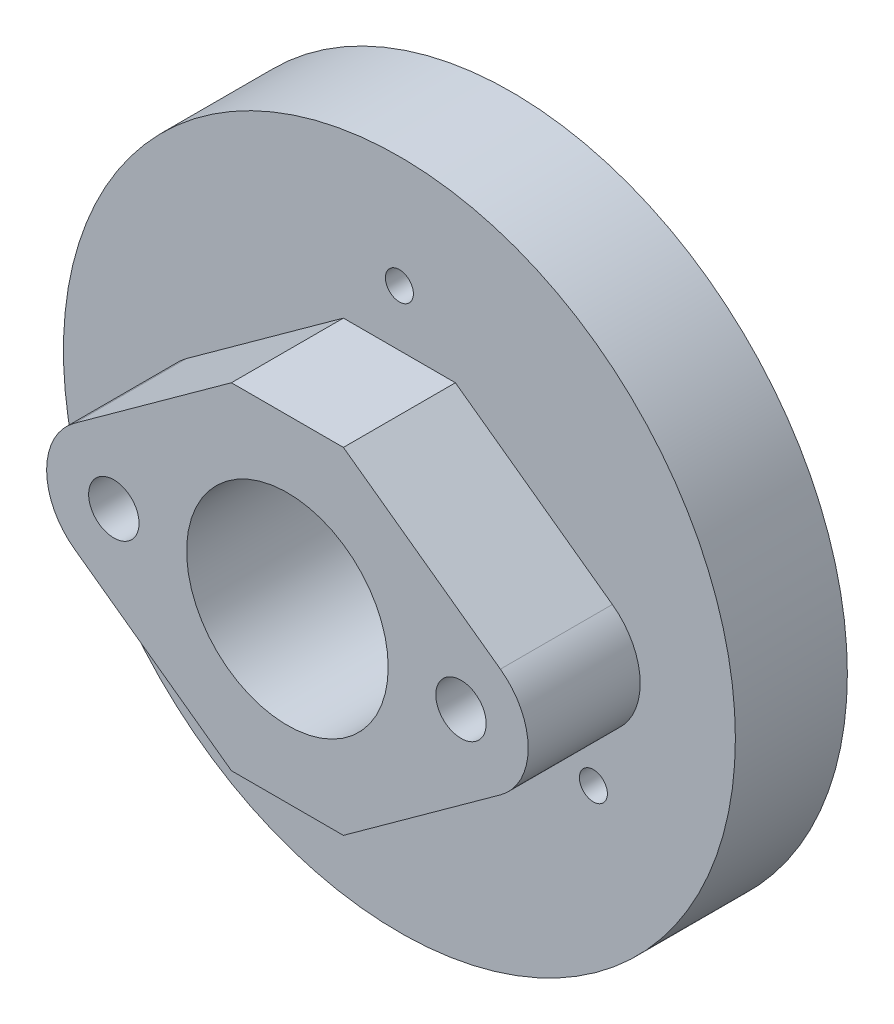
ISO-10303-21;
HEADER;
FILE_DESCRIPTION(('STEP AP214'),'2;1');
FILE_NAME('part.step','',(''),(''),'','','');
FILE_SCHEMA(('AUTOMOTIVE_DESIGN { 1 0 10303 214 1 1 1 1 }'));
ENDSEC;
DATA;
#1=APPLICATION_CONTEXT('core data for automotive mechanical design processes');
#2=APPLICATION_PROTOCOL_DEFINITION('international standard','automotive_design',2000,#1);
#3=PRODUCT_CONTEXT('',#1,'mechanical');
#4=PRODUCT('Part','Part','',(#3));
#5=PRODUCT_RELATED_PRODUCT_CATEGORY('part','',(#4));
#6=PRODUCT_DEFINITION_FORMATION('','',#4);
#7=PRODUCT_DEFINITION_CONTEXT('part definition',#1,'design');
#8=PRODUCT_DEFINITION('design','',#6,#7);
#9=PRODUCT_DEFINITION_SHAPE('','',#8);
#10=(LENGTH_UNIT() NAMED_UNIT(*) SI_UNIT(.MILLI.,.METRE.));
#11=(NAMED_UNIT(*) PLANE_ANGLE_UNIT() SI_UNIT($,.RADIAN.));
#12=(NAMED_UNIT(*) SI_UNIT($,.STERADIAN.) SOLID_ANGLE_UNIT());
#13=UNCERTAINTY_MEASURE_WITH_UNIT(LENGTH_MEASURE(1.E-05),#10,'distance_accuracy_value','');
#14=(GEOMETRIC_REPRESENTATION_CONTEXT(3) GLOBAL_UNCERTAINTY_ASSIGNED_CONTEXT((#13)) GLOBAL_UNIT_ASSIGNED_CONTEXT((#10,
#11,#12)) REPRESENTATION_CONTEXT('',''));
#15=CARTESIAN_POINT('',(0.,0.,0.));
#16=DIRECTION('',(0.,0.,1.));
#17=DIRECTION('',(1.,0.,0.));
#18=AXIS2_PLACEMENT_3D('',#15,#16,#17);
#19=CARTESIAN_POINT('',(15.5,0.,0.));
#20=DIRECTION('',(0.,0.,1.));
#21=DIRECTION('',(1.,0.,0.));
#22=AXIS2_PLACEMENT_3D('',#19,#20,#21);
#23=CYLINDRICAL_SURFACE('',#22,2.25);
#24=CARTESIAN_POINT('',(15.5,0.,20.));
#25=DIRECTION('',(0.,0.,1.));
#26=DIRECTION('',(1.,0.,0.));
#27=AXIS2_PLACEMENT_3D('',#24,#25,#26);
#28=CIRCLE('',#27,2.25);
#29=CARTESIAN_POINT('',(17.75,0.,20.));
#30=VERTEX_POINT('',#29);
#31=EDGE_CURVE('E165',#30,#30,#28,.T.);
#32=ORIENTED_EDGE('',*,*,#31,.T.);
#33=EDGE_LOOP('',(#32));
#34=FACE_BOUND('',#33,.T.);
#35=CARTESIAN_POINT('',(15.5,0.,5.));
#36=DIRECTION('',(0.,0.,-1.));
#37=DIRECTION('',(-1.,0.,0.));
#38=AXIS2_PLACEMENT_3D('',#35,#36,#37);
#39=CIRCLE('',#38,2.25);
#40=CARTESIAN_POINT('',(13.25,0.,5.));
#41=VERTEX_POINT('',#40);
#42=EDGE_CURVE('E44',#41,#41,#39,.F.);
#43=ORIENTED_EDGE('',*,*,#42,.F.);
#44=EDGE_LOOP('',(#43));
#45=FACE_BOUND('',#44,.T.);
#46=ADVANCED_FACE('F41',(#34,#45),#23,.F.);
#47=CARTESIAN_POINT('',(-15.5,0.,0.));
#48=DIRECTION('',(0.,0.,1.));
#49=DIRECTION('',(1.,0.,0.));
#50=AXIS2_PLACEMENT_3D('',#47,#48,#49);
#51=CYLINDRICAL_SURFACE('',#50,2.25);
#52=CARTESIAN_POINT('',(-15.5,0.,20.));
#53=DIRECTION('',(0.,0.,1.));
#54=DIRECTION('',(1.,0.,0.));
#55=AXIS2_PLACEMENT_3D('',#52,#53,#54);
#56=CIRCLE('',#55,2.25);
#57=CARTESIAN_POINT('',(-13.25,0.,20.));
#58=VERTEX_POINT('',#57);
#59=EDGE_CURVE('E180',#58,#58,#56,.T.);
#60=ORIENTED_EDGE('',*,*,#59,.T.);
#61=EDGE_LOOP('',(#60));
#62=FACE_BOUND('',#61,.T.);
#63=CARTESIAN_POINT('',(-15.5,0.,5.));
#64=DIRECTION('',(0.,0.,-1.));
#65=DIRECTION('',(-1.,0.,0.));
#66=AXIS2_PLACEMENT_3D('',#63,#64,#65);
#67=CIRCLE('',#66,2.25);
#68=CARTESIAN_POINT('',(-17.75,0.,5.));
#69=VERTEX_POINT('',#68);
#70=EDGE_CURVE('E156',#69,#69,#67,.F.);
#71=ORIENTED_EDGE('',*,*,#70,.F.);
#72=EDGE_LOOP('',(#71));
#73=FACE_BOUND('',#72,.T.);
#74=ADVANCED_FACE('F262',(#62,#73),#51,.F.);
#75=CARTESIAN_POINT('',(0.,0.,10.));
#76=DIRECTION('',(0.,0.,1.));
#77=DIRECTION('',(1.,0.,0.));
#78=AXIS2_PLACEMENT_3D('',#75,#76,#77);
#79=PLANE('',#78);
#80=DIRECTION('',(-0.810254618541581,-0.586078026487973,0.));
#81=VECTOR('',#80,1.);
#82=CARTESIAN_POINT('',(-5.,15.,10.));
#83=LINE('',#82,#81);
#84=CARTESIAN_POINT('',(-5.,15.,10.));
#85=VERTEX_POINT('',#84);
#86=CARTESIAN_POINT('',(-19.0164681589278,4.86152771124949,10.));
#87=VERTEX_POINT('',#86);
#88=EDGE_CURVE('E59',#85,#87,#83,.T.);
#89=ORIENTED_EDGE('',*,*,#88,.F.);
#90=DIRECTION('',(-1.,0.,0.));
#91=VECTOR('',#90,1.);
#92=CARTESIAN_POINT('',(5.,15.,10.));
#93=LINE('',#92,#91);
#94=CARTESIAN_POINT('',(5.,15.,10.));
#95=VERTEX_POINT('',#94);
#96=EDGE_CURVE('E65',#95,#85,#93,.T.);
#97=ORIENTED_EDGE('',*,*,#96,.F.);
#98=DIRECTION('',(-0.810254618541581,0.586078026487973,0.));
#99=VECTOR('',#98,1.);
#100=CARTESIAN_POINT('',(5.,15.,10.));
#101=LINE('',#100,#99);
#102=CARTESIAN_POINT('',(19.0164681589278,4.86152771124949,10.));
#103=VERTEX_POINT('',#102);
#104=EDGE_CURVE('E211',#103,#95,#101,.T.);
#105=ORIENTED_EDGE('',*,*,#104,.F.);
#106=CARTESIAN_POINT('',(15.5,0.,10.));
#107=DIRECTION('',(0.,0.,1.));
#108=DIRECTION('',(-1.,0.,0.));
#109=AXIS2_PLACEMENT_3D('',#106,#107,#108);
#110=CIRCLE('',#109,6.);
#111=CARTESIAN_POINT('',(19.0164681589278,-4.86152771124948,10.));
#112=VERTEX_POINT('',#111);
#113=EDGE_CURVE('E208',#112,#103,#110,.T.);
#114=ORIENTED_EDGE('',*,*,#113,.F.);
#115=DIRECTION('',(0.810254618541581,0.586078026487973,0.));
#116=VECTOR('',#115,1.);
#117=CARTESIAN_POINT('',(19.0164681589278,-4.86152771124948,10.));
#118=LINE('',#117,#116);
#119=CARTESIAN_POINT('',(5.,-15.,10.));
#120=VERTEX_POINT('',#119);
#121=EDGE_CURVE('E202',#120,#112,#118,.T.);
#122=ORIENTED_EDGE('',*,*,#121,.F.);
#123=DIRECTION('',(1.,0.,0.));
#124=VECTOR('',#123,1.);
#125=CARTESIAN_POINT('',(-5.,-15.,10.));
#126=LINE('',#125,#124);
#127=CARTESIAN_POINT('',(-5.,-15.,10.));
#128=VERTEX_POINT('',#127);
#129=EDGE_CURVE('E205',#128,#120,#126,.T.);
#130=ORIENTED_EDGE('',*,*,#129,.F.);
#131=DIRECTION('',(0.810254618541581,-0.586078026487973,0.));
#132=VECTOR('',#131,1.);
#133=CARTESIAN_POINT('',(-19.0164681589278,-4.86152771124949,10.));
#134=LINE('',#133,#132);
#135=CARTESIAN_POINT('',(-19.0164681589278,-4.86152771124949,10.));
#136=VERTEX_POINT('',#135);
#137=EDGE_CURVE('E200',#136,#128,#134,.T.);
#138=ORIENTED_EDGE('',*,*,#137,.F.);
#139=CARTESIAN_POINT('',(-15.5,0.,10.));
#140=DIRECTION('',(0.,0.,1.));
#141=DIRECTION('',(1.,0.,0.));
#142=AXIS2_PLACEMENT_3D('',#139,#140,#141);
#143=CIRCLE('',#142,6.);
#144=EDGE_CURVE('E197',#87,#136,#143,.T.);
#145=ORIENTED_EDGE('',*,*,#144,.F.);
#146=EDGE_LOOP('',(#89,#97,#105,#114,#122,#130,#138,#145));
#147=FACE_BOUND('',#146,.T.);
#148=CARTESIAN_POINT('',(17.3205080756887,-10.0000000000001,10.));
#149=DIRECTION('',(0.,0.,1.));
#150=DIRECTION('',(1.,0.,0.));
#151=AXIS2_PLACEMENT_3D('',#148,#149,#150);
#152=CIRCLE('',#151,1.25);
#153=CARTESIAN_POINT('',(18.5705080756887,-10.0000000000001,10.));
#154=VERTEX_POINT('',#153);
#155=EDGE_CURVE('E143',#154,#154,#152,.T.);
#156=ORIENTED_EDGE('',*,*,#155,.F.);
#157=EDGE_LOOP('',(#156));
#158=FACE_BOUND('',#157,.T.);
#159=CARTESIAN_POINT('',(0.,0.,10.));
#160=DIRECTION('',(0.,0.,1.));
#161=DIRECTION('',(1.,0.,0.));
#162=AXIS2_PLACEMENT_3D('',#159,#160,#161);
#163=CIRCLE('',#162,30.);
#164=CARTESIAN_POINT('',(30.,0.,10.));
#165=VERTEX_POINT('',#164);
#166=EDGE_CURVE('E11',#165,#165,#163,.T.);
#167=ORIENTED_EDGE('',*,*,#166,.T.);
#168=EDGE_LOOP('',(#167));
#169=FACE_BOUND('',#168,.T.);
#170=CARTESIAN_POINT('',(0.,20.,10.));
#171=DIRECTION('',(0.,0.,1.));
#172=DIRECTION('',(1.,0.,0.));
#173=AXIS2_PLACEMENT_3D('',#170,#171,#172);
#174=CIRCLE('',#173,1.25);
#175=CARTESIAN_POINT('',(1.25,20.,10.));
#176=VERTEX_POINT('',#175);
#177=EDGE_CURVE('E150',#176,#176,#174,.T.);
#178=ORIENTED_EDGE('',*,*,#177,.F.);
#179=EDGE_LOOP('',(#178));
#180=FACE_BOUND('',#179,.T.);
#181=CARTESIAN_POINT('',(-17.3205080756889,-9.99999999999984,10.));
#182=DIRECTION('',(0.,0.,1.));
#183=DIRECTION('',(1.,0.,0.));
#184=AXIS2_PLACEMENT_3D('',#181,#182,#183);
#185=CIRCLE('',#184,1.25);
#186=CARTESIAN_POINT('',(-16.0705080756889,-9.99999999999984,10.));
#187=VERTEX_POINT('',#186);
#188=EDGE_CURVE('E135',#187,#187,#185,.T.);
#189=ORIENTED_EDGE('',*,*,#188,.F.);
#190=EDGE_LOOP('',(#189));
#191=FACE_BOUND('',#190,.T.);
#192=ADVANCED_FACE('F234',(#147,#158,#169,#180,#191),#79,.T.);
#193=CARTESIAN_POINT('',(0.,0.,0.));
#194=DIRECTION('',(0.,0.,1.));
#195=DIRECTION('',(1.,0.,0.));
#196=AXIS2_PLACEMENT_3D('',#193,#194,#195);
#197=PLANE('',#196);
#198=CARTESIAN_POINT('',(15.5,0.,0.));
#199=DIRECTION('',(0.,0.,-1.));
#200=DIRECTION('',(-1.,0.,0.));
#201=AXIS2_PLACEMENT_3D('',#198,#199,#200);
#202=CIRCLE('',#201,4.);
#203=CARTESIAN_POINT('',(11.5,0.,0.));
#204=VERTEX_POINT('',#203);
#205=EDGE_CURVE('E163',#204,#204,#202,.T.);
#206=ORIENTED_EDGE('',*,*,#205,.F.);
#207=EDGE_LOOP('',(#206));
#208=FACE_BOUND('',#207,.T.);
#209=CARTESIAN_POINT('',(-15.5,0.,0.));
#210=DIRECTION('',(0.,0.,-1.));
#211=DIRECTION('',(-1.,0.,0.));
#212=AXIS2_PLACEMENT_3D('',#209,#210,#211);
#213=CIRCLE('',#212,4.);
#214=CARTESIAN_POINT('',(-19.5,0.,0.));
#215=VERTEX_POINT('',#214);
#216=EDGE_CURVE('E166',#215,#215,#213,.T.);
#217=ORIENTED_EDGE('',*,*,#216,.F.);
#218=EDGE_LOOP('',(#217));
#219=FACE_BOUND('',#218,.T.);
#220=CARTESIAN_POINT('',(0.,0.,0.));
#221=DIRECTION('',(0.,0.,1.));
#222=DIRECTION('',(1.,0.,0.));
#223=AXIS2_PLACEMENT_3D('',#220,#221,#222);
#224=CIRCLE('',#223,30.);
#225=CARTESIAN_POINT('',(30.,0.,0.));
#226=VERTEX_POINT('',#225);
#227=EDGE_CURVE('E49',#226,#226,#224,.T.);
#228=ORIENTED_EDGE('',*,*,#227,.F.);
#229=EDGE_LOOP('',(#228));
#230=FACE_BOUND('',#229,.T.);
#231=CARTESIAN_POINT('',(0.,0.,0.));
#232=DIRECTION('',(0.,0.,1.));
#233=DIRECTION('',(1.,0.,0.));
#234=AXIS2_PLACEMENT_3D('',#231,#232,#233);
#235=CIRCLE('',#234,9.);
#236=CARTESIAN_POINT('',(9.,0.,0.));
#237=VERTEX_POINT('',#236);
#238=EDGE_CURVE('E147',#237,#237,#235,.T.);
#239=ORIENTED_EDGE('',*,*,#238,.T.);
#240=EDGE_LOOP('',(#239));
#241=FACE_BOUND('',#240,.T.);
#242=CARTESIAN_POINT('',(0.,20.,0.));
#243=DIRECTION('',(0.,0.,1.));
#244=DIRECTION('',(1.,0.,0.));
#245=AXIS2_PLACEMENT_3D('',#242,#243,#244);
#246=CIRCLE('',#245,1.25);
#247=CARTESIAN_POINT('',(1.25,20.,0.));
#248=VERTEX_POINT('',#247);
#249=EDGE_CURVE('E145',#248,#248,#246,.T.);
#250=ORIENTED_EDGE('',*,*,#249,.T.);
#251=EDGE_LOOP('',(#250));
#252=FACE_BOUND('',#251,.T.);
#253=CARTESIAN_POINT('',(17.3205080756887,-10.0000000000001,0.));
#254=DIRECTION('',(0.,0.,1.));
#255=DIRECTION('',(1.,0.,0.));
#256=AXIS2_PLACEMENT_3D('',#253,#254,#255);
#257=CIRCLE('',#256,1.25);
#258=CARTESIAN_POINT('',(18.5705080756887,-10.0000000000001,0.));
#259=VERTEX_POINT('',#258);
#260=EDGE_CURVE('E139',#259,#259,#257,.T.);
#261=ORIENTED_EDGE('',*,*,#260,.T.);
#262=EDGE_LOOP('',(#261));
#263=FACE_BOUND('',#262,.T.);
#264=CARTESIAN_POINT('',(-17.3205080756889,-9.99999999999984,0.));
#265=DIRECTION('',(0.,0.,1.));
#266=DIRECTION('',(1.,0.,0.));
#267=AXIS2_PLACEMENT_3D('',#264,#265,#266);
#268=CIRCLE('',#267,1.25);
#269=CARTESIAN_POINT('',(-16.0705080756889,-9.99999999999984,0.));
#270=VERTEX_POINT('',#269);
#271=EDGE_CURVE('E129',#270,#270,#268,.T.);
#272=ORIENTED_EDGE('',*,*,#271,.T.);
#273=EDGE_LOOP('',(#272));
#274=FACE_BOUND('',#273,.T.);
#275=ADVANCED_FACE('F304',(#208,#219,#230,#241,#252,#263,#274),#197,.F.);
#276=CARTESIAN_POINT('',(0.,0.,10.));
#277=DIRECTION('',(0.,0.,-1.));
#278=DIRECTION('',(-1.,0.,0.));
#279=AXIS2_PLACEMENT_3D('',#276,#277,#278);
#280=CYLINDRICAL_SURFACE('',#279,30.);
#281=ORIENTED_EDGE('',*,*,#166,.F.);
#282=EDGE_LOOP('',(#281));
#283=FACE_BOUND('',#282,.T.);
#284=ORIENTED_EDGE('',*,*,#227,.T.);
#285=EDGE_LOOP('',(#284));
#286=FACE_BOUND('',#285,.T.);
#287=ADVANCED_FACE('F43',(#283,#286),#280,.T.);
#288=CARTESIAN_POINT('',(0.,0.,10.));
#289=DIRECTION('',(0.,0.,-1.));
#290=DIRECTION('',(-1.,0.,0.));
#291=AXIS2_PLACEMENT_3D('',#288,#289,#290);
#292=CYLINDRICAL_SURFACE('',#291,9.);
#293=ORIENTED_EDGE('',*,*,#238,.F.);
#294=EDGE_LOOP('',(#293));
#295=FACE_BOUND('',#294,.T.);
#296=CARTESIAN_POINT('',(0.,0.,20.));
#297=DIRECTION('',(0.,0.,1.));
#298=DIRECTION('',(1.,0.,0.));
#299=AXIS2_PLACEMENT_3D('',#296,#297,#298);
#300=CIRCLE('',#299,9.);
#301=CARTESIAN_POINT('',(9.,0.,20.));
#302=VERTEX_POINT('',#301);
#303=EDGE_CURVE('E176',#302,#302,#300,.T.);
#304=ORIENTED_EDGE('',*,*,#303,.T.);
#305=EDGE_LOOP('',(#304));
#306=FACE_BOUND('',#305,.T.);
#307=ADVANCED_FACE('F299',(#295,#306),#292,.F.);
#308=CARTESIAN_POINT('',(0.,20.,10.));
#309=DIRECTION('',(0.,0.,-1.));
#310=DIRECTION('',(-1.,0.,0.));
#311=AXIS2_PLACEMENT_3D('',#308,#309,#310);
#312=CYLINDRICAL_SURFACE('',#311,1.25);
#313=ORIENTED_EDGE('',*,*,#177,.T.);
#314=EDGE_LOOP('',(#313));
#315=FACE_BOUND('',#314,.T.);
#316=ORIENTED_EDGE('',*,*,#249,.F.);
#317=EDGE_LOOP('',(#316));
#318=FACE_BOUND('',#317,.T.);
#319=ADVANCED_FACE('F292',(#315,#318),#312,.F.);
#320=CARTESIAN_POINT('',(17.3205080756887,-10.0000000000001,10.));
#321=DIRECTION('',(0.,0.,-1.));
#322=DIRECTION('',(-1.,0.,0.));
#323=AXIS2_PLACEMENT_3D('',#320,#321,#322);
#324=CYLINDRICAL_SURFACE('',#323,1.25);
#325=ORIENTED_EDGE('',*,*,#155,.T.);
#326=EDGE_LOOP('',(#325));
#327=FACE_BOUND('',#326,.T.);
#328=ORIENTED_EDGE('',*,*,#260,.F.);
#329=EDGE_LOOP('',(#328));
#330=FACE_BOUND('',#329,.T.);
#331=ADVANCED_FACE('F278',(#327,#330),#324,.F.);
#332=CARTESIAN_POINT('',(-17.3205080756889,-9.99999999999984,10.));
#333=DIRECTION('',(0.,0.,-1.));
#334=DIRECTION('',(-1.,0.,0.));
#335=AXIS2_PLACEMENT_3D('',#332,#333,#334);
#336=CYLINDRICAL_SURFACE('',#335,1.25);
#337=ORIENTED_EDGE('',*,*,#188,.T.);
#338=EDGE_LOOP('',(#337));
#339=FACE_BOUND('',#338,.T.);
#340=ORIENTED_EDGE('',*,*,#271,.F.);
#341=EDGE_LOOP('',(#340));
#342=FACE_BOUND('',#341,.T.);
#343=ADVANCED_FACE('F272',(#339,#342),#336,.F.);
#344=CARTESIAN_POINT('',(-15.5,0.,20.));
#345=DIRECTION('',(0.,0.,1.));
#346=DIRECTION('',(1.,0.,0.));
#347=AXIS2_PLACEMENT_3D('',#344,#345,#346);
#348=PLANE('',#347);
#349=ORIENTED_EDGE('',*,*,#59,.F.);
#350=EDGE_LOOP('',(#349));
#351=FACE_BOUND('',#350,.T.);
#352=ORIENTED_EDGE('',*,*,#31,.F.);
#353=EDGE_LOOP('',(#352));
#354=FACE_BOUND('',#353,.T.);
#355=DIRECTION('',(-0.810254618541581,-0.586078026487973,0.));
#356=VECTOR('',#355,1.);
#357=CARTESIAN_POINT('',(-5.,15.,20.));
#358=LINE('',#357,#356);
#359=CARTESIAN_POINT('',(-5.,15.,20.));
#360=VERTEX_POINT('',#359);
#361=CARTESIAN_POINT('',(-19.0164681589278,4.86152771124949,20.));
#362=VERTEX_POINT('',#361);
#363=EDGE_CURVE('E120',#360,#362,#358,.T.);
#364=ORIENTED_EDGE('',*,*,#363,.T.);
#365=CARTESIAN_POINT('',(-15.5,0.,20.));
#366=DIRECTION('',(0.,0.,1.));
#367=DIRECTION('',(1.,0.,0.));
#368=AXIS2_PLACEMENT_3D('',#365,#366,#367);
#369=CIRCLE('',#368,6.);
#370=CARTESIAN_POINT('',(-19.0164681589278,-4.86152771124949,20.));
#371=VERTEX_POINT('',#370);
#372=EDGE_CURVE('E106',#362,#371,#369,.T.);
#373=ORIENTED_EDGE('',*,*,#372,.T.);
#374=DIRECTION('',(0.810254618541581,-0.586078026487973,0.));
#375=VECTOR('',#374,1.);
#376=CARTESIAN_POINT('',(-19.0164681589278,-4.86152771124949,20.));
#377=LINE('',#376,#375);
#378=CARTESIAN_POINT('',(-5.,-15.,20.));
#379=VERTEX_POINT('',#378);
#380=EDGE_CURVE('E118',#371,#379,#377,.T.);
#381=ORIENTED_EDGE('',*,*,#380,.T.);
#382=DIRECTION('',(1.,0.,0.));
#383=VECTOR('',#382,1.);
#384=CARTESIAN_POINT('',(-5.,-15.,20.));
#385=LINE('',#384,#383);
#386=CARTESIAN_POINT('',(5.,-15.,20.));
#387=VERTEX_POINT('',#386);
#388=EDGE_CURVE('E188',#379,#387,#385,.T.);
#389=ORIENTED_EDGE('',*,*,#388,.T.);
#390=DIRECTION('',(0.810254618541581,0.586078026487973,0.));
#391=VECTOR('',#390,1.);
#392=CARTESIAN_POINT('',(19.0164681589278,-4.86152771124948,20.));
#393=LINE('',#392,#391);
#394=CARTESIAN_POINT('',(19.0164681589278,-4.86152771124948,20.));
#395=VERTEX_POINT('',#394);
#396=EDGE_CURVE('E186',#387,#395,#393,.T.);
#397=ORIENTED_EDGE('',*,*,#396,.T.);
#398=CARTESIAN_POINT('',(15.5,0.,20.));
#399=DIRECTION('',(0.,0.,1.));
#400=DIRECTION('',(-1.,0.,0.));
#401=AXIS2_PLACEMENT_3D('',#398,#399,#400);
#402=CIRCLE('',#401,6.);
#403=CARTESIAN_POINT('',(19.0164681589278,4.86152771124949,20.));
#404=VERTEX_POINT('',#403);
#405=EDGE_CURVE('E187',#395,#404,#402,.T.);
#406=ORIENTED_EDGE('',*,*,#405,.T.);
#407=DIRECTION('',(-0.810254618541581,0.586078026487973,0.));
#408=VECTOR('',#407,1.);
#409=CARTESIAN_POINT('',(5.,15.,20.));
#410=LINE('',#409,#408);
#411=CARTESIAN_POINT('',(5.,15.,20.));
#412=VERTEX_POINT('',#411);
#413=EDGE_CURVE('E195',#404,#412,#410,.T.);
#414=ORIENTED_EDGE('',*,*,#413,.T.);
#415=DIRECTION('',(-1.,0.,0.));
#416=VECTOR('',#415,1.);
#417=CARTESIAN_POINT('',(5.,15.,20.));
#418=LINE('',#417,#416);
#419=EDGE_CURVE('E123',#412,#360,#418,.T.);
#420=ORIENTED_EDGE('',*,*,#419,.T.);
#421=EDGE_LOOP('',(#364,#373,#381,#389,#397,#406,#414,#420));
#422=FACE_BOUND('',#421,.T.);
#423=ORIENTED_EDGE('',*,*,#303,.F.);
#424=EDGE_LOOP('',(#423));
#425=FACE_BOUND('',#424,.T.);
#426=ADVANCED_FACE('F117',(#351,#354,#422,#425),#348,.T.);
#427=CARTESIAN_POINT('',(-5.,15.,20.));
#428=DIRECTION('',(0.586078026487973,-0.810254618541581,0.));
#429=DIRECTION('',(0.810254618541581,0.586078026487973,0.));
#430=AXIS2_PLACEMENT_3D('',#427,#428,#429);
#431=PLANE('',#430);
#432=ORIENTED_EDGE('',*,*,#88,.T.);
#433=DIRECTION('',(0.,0.,-1.));
#434=VECTOR('',#433,1.);
#435=CARTESIAN_POINT('',(-19.0164681589278,4.86152771124949,20.));
#436=LINE('',#435,#434);
#437=EDGE_CURVE('E112',#362,#87,#436,.T.);
#438=ORIENTED_EDGE('',*,*,#437,.F.);
#439=ORIENTED_EDGE('',*,*,#363,.F.);
#440=DIRECTION('',(0.,0.,-1.));
#441=VECTOR('',#440,1.);
#442=CARTESIAN_POINT('',(-5.,15.,20.));
#443=LINE('',#442,#441);
#444=EDGE_CURVE('E191',#360,#85,#443,.T.);
#445=ORIENTED_EDGE('',*,*,#444,.T.);
#446=EDGE_LOOP('',(#432,#438,#439,#445));
#447=FACE_BOUND('',#446,.T.);
#448=ADVANCED_FACE('F126',(#447),#431,.F.);
#449=CARTESIAN_POINT('',(-15.5,0.,20.));
#450=DIRECTION('',(0.,0.,-1.));
#451=DIRECTION('',(-1.,0.,0.));
#452=AXIS2_PLACEMENT_3D('',#449,#450,#451);
#453=CYLINDRICAL_SURFACE('',#452,6.);
#454=ORIENTED_EDGE('',*,*,#144,.T.);
#455=DIRECTION('',(0.,0.,-1.));
#456=VECTOR('',#455,1.);
#457=CARTESIAN_POINT('',(-19.0164681589278,-4.86152771124949,20.));
#458=LINE('',#457,#456);
#459=EDGE_CURVE('E114',#371,#136,#458,.T.);
#460=ORIENTED_EDGE('',*,*,#459,.F.);
#461=ORIENTED_EDGE('',*,*,#372,.F.);
#462=ORIENTED_EDGE('',*,*,#437,.T.);
#463=EDGE_LOOP('',(#454,#460,#461,#462));
#464=FACE_BOUND('',#463,.T.);
#465=ADVANCED_FACE('F108',(#464),#453,.T.);
#466=CARTESIAN_POINT('',(-19.0164681589278,-4.86152771124949,20.));
#467=DIRECTION('',(0.586078026487973,0.810254618541581,0.));
#468=DIRECTION('',(-0.810254618541581,0.586078026487973,0.));
#469=AXIS2_PLACEMENT_3D('',#466,#467,#468);
#470=PLANE('',#469);
#471=ORIENTED_EDGE('',*,*,#137,.T.);
#472=DIRECTION('',(0.,0.,-1.));
#473=VECTOR('',#472,1.);
#474=CARTESIAN_POINT('',(-5.,-15.,20.));
#475=LINE('',#474,#473);
#476=EDGE_CURVE('E134',#379,#128,#475,.T.);
#477=ORIENTED_EDGE('',*,*,#476,.F.);
#478=ORIENTED_EDGE('',*,*,#380,.F.);
#479=ORIENTED_EDGE('',*,*,#459,.T.);
#480=EDGE_LOOP('',(#471,#477,#478,#479));
#481=FACE_BOUND('',#480,.T.);
#482=ADVANCED_FACE('F233',(#481),#470,.F.);
#483=CARTESIAN_POINT('',(-5.,-15.,20.));
#484=DIRECTION('',(0.,1.,0.));
#485=DIRECTION('',(-1.,0.,0.));
#486=AXIS2_PLACEMENT_3D('',#483,#484,#485);
#487=PLANE('',#486);
#488=ORIENTED_EDGE('',*,*,#129,.T.);
#489=DIRECTION('',(0.,0.,-1.));
#490=VECTOR('',#489,1.);
#491=CARTESIAN_POINT('',(5.,-15.,20.));
#492=LINE('',#491,#490);
#493=EDGE_CURVE('E221',#387,#120,#492,.T.);
#494=ORIENTED_EDGE('',*,*,#493,.F.);
#495=ORIENTED_EDGE('',*,*,#388,.F.);
#496=ORIENTED_EDGE('',*,*,#476,.T.);
#497=EDGE_LOOP('',(#488,#494,#495,#496));
#498=FACE_BOUND('',#497,.T.);
#499=ADVANCED_FACE('F227',(#498),#487,.F.);
#500=CARTESIAN_POINT('',(19.0164681589278,-4.86152771124948,20.));
#501=DIRECTION('',(-0.586078026487973,0.810254618541581,0.));
#502=DIRECTION('',(-0.810254618541581,-0.586078026487973,0.));
#503=AXIS2_PLACEMENT_3D('',#500,#501,#502);
#504=PLANE('',#503);
#505=ORIENTED_EDGE('',*,*,#121,.T.);
#506=DIRECTION('',(0.,0.,-1.));
#507=VECTOR('',#506,1.);
#508=CARTESIAN_POINT('',(19.0164681589278,-4.86152771124948,20.));
#509=LINE('',#508,#507);
#510=EDGE_CURVE('E222',#395,#112,#509,.T.);
#511=ORIENTED_EDGE('',*,*,#510,.F.);
#512=ORIENTED_EDGE('',*,*,#396,.F.);
#513=ORIENTED_EDGE('',*,*,#493,.T.);
#514=EDGE_LOOP('',(#505,#511,#512,#513));
#515=FACE_BOUND('',#514,.T.);
#516=ADVANCED_FACE('F236',(#515),#504,.F.);
#517=CARTESIAN_POINT('',(15.5,0.,20.));
#518=DIRECTION('',(0.,0.,-1.));
#519=DIRECTION('',(-1.,0.,0.));
#520=AXIS2_PLACEMENT_3D('',#517,#518,#519);
#521=CYLINDRICAL_SURFACE('',#520,6.);
#522=ORIENTED_EDGE('',*,*,#113,.T.);
#523=DIRECTION('',(0.,0.,-1.));
#524=VECTOR('',#523,1.);
#525=CARTESIAN_POINT('',(19.0164681589278,4.86152771124949,20.));
#526=LINE('',#525,#524);
#527=EDGE_CURVE('E217',#404,#103,#526,.T.);
#528=ORIENTED_EDGE('',*,*,#527,.F.);
#529=ORIENTED_EDGE('',*,*,#405,.F.);
#530=ORIENTED_EDGE('',*,*,#510,.T.);
#531=EDGE_LOOP('',(#522,#528,#529,#530));
#532=FACE_BOUND('',#531,.T.);
#533=ADVANCED_FACE('F245',(#532),#521,.T.);
#534=CARTESIAN_POINT('',(5.,15.,20.));
#535=DIRECTION('',(-0.586078026487973,-0.810254618541581,0.));
#536=DIRECTION('',(0.810254618541581,-0.586078026487973,0.));
#537=AXIS2_PLACEMENT_3D('',#534,#535,#536);
#538=PLANE('',#537);
#539=ORIENTED_EDGE('',*,*,#104,.T.);
#540=DIRECTION('',(0.,0.,-1.));
#541=VECTOR('',#540,1.);
#542=CARTESIAN_POINT('',(5.,15.,20.));
#543=LINE('',#542,#541);
#544=EDGE_CURVE('E214',#412,#95,#543,.T.);
#545=ORIENTED_EDGE('',*,*,#544,.F.);
#546=ORIENTED_EDGE('',*,*,#413,.F.);
#547=ORIENTED_EDGE('',*,*,#527,.T.);
#548=EDGE_LOOP('',(#539,#545,#546,#547));
#549=FACE_BOUND('',#548,.T.);
#550=ADVANCED_FACE('F250',(#549),#538,.F.);
#551=CARTESIAN_POINT('',(5.,15.,20.));
#552=DIRECTION('',(0.,-1.,0.));
#553=DIRECTION('',(1.,0.,0.));
#554=AXIS2_PLACEMENT_3D('',#551,#552,#553);
#555=PLANE('',#554);
#556=ORIENTED_EDGE('',*,*,#96,.T.);
#557=ORIENTED_EDGE('',*,*,#444,.F.);
#558=ORIENTED_EDGE('',*,*,#419,.F.);
#559=ORIENTED_EDGE('',*,*,#544,.T.);
#560=EDGE_LOOP('',(#556,#557,#558,#559));
#561=FACE_BOUND('',#560,.T.);
#562=ADVANCED_FACE('F249',(#561),#555,.F.);
#563=CARTESIAN_POINT('',(-15.5,0.,5.));
#564=DIRECTION('',(0.,0.,-1.));
#565=DIRECTION('',(-1.,0.,0.));
#566=AXIS2_PLACEMENT_3D('',#563,#564,#565);
#567=PLANE('',#566);
#568=CARTESIAN_POINT('',(-15.5,0.,5.));
#569=DIRECTION('',(0.,0.,-1.));
#570=DIRECTION('',(-1.,0.,0.));
#571=AXIS2_PLACEMENT_3D('',#568,#569,#570);
#572=CIRCLE('',#571,4.);
#573=CARTESIAN_POINT('',(-19.5,0.,5.));
#574=VERTEX_POINT('',#573);
#575=EDGE_CURVE('E174',#574,#574,#572,.T.);
#576=ORIENTED_EDGE('',*,*,#575,.T.);
#577=EDGE_LOOP('',(#576));
#578=FACE_BOUND('',#577,.T.);
#579=ORIENTED_EDGE('',*,*,#70,.T.);
#580=EDGE_LOOP('',(#579));
#581=FACE_BOUND('',#580,.T.);
#582=ADVANCED_FACE('F253',(#578,#581),#567,.T.);
#583=CARTESIAN_POINT('',(-15.5,0.,5.));
#584=DIRECTION('',(0.,0.,-1.));
#585=DIRECTION('',(-1.,0.,0.));
#586=AXIS2_PLACEMENT_3D('',#583,#584,#585);
#587=CYLINDRICAL_SURFACE('',#586,4.);
#588=ORIENTED_EDGE('',*,*,#575,.F.);
#589=EDGE_LOOP('',(#588));
#590=FACE_BOUND('',#589,.T.);
#591=ORIENTED_EDGE('',*,*,#216,.T.);
#592=EDGE_LOOP('',(#591));
#593=FACE_BOUND('',#592,.T.);
#594=ADVANCED_FACE('F256',(#590,#593),#587,.F.);
#595=CARTESIAN_POINT('',(15.5,0.,5.));
#596=DIRECTION('',(0.,0.,-1.));
#597=DIRECTION('',(-1.,0.,0.));
#598=AXIS2_PLACEMENT_3D('',#595,#596,#597);
#599=PLANE('',#598);
#600=CARTESIAN_POINT('',(15.5,0.,5.));
#601=DIRECTION('',(0.,0.,-1.));
#602=DIRECTION('',(-1.,0.,0.));
#603=AXIS2_PLACEMENT_3D('',#600,#601,#602);
#604=CIRCLE('',#603,4.);
#605=CARTESIAN_POINT('',(11.5,0.,5.));
#606=VERTEX_POINT('',#605);
#607=EDGE_CURVE('E158',#606,#606,#604,.T.);
#608=ORIENTED_EDGE('',*,*,#607,.T.);
#609=EDGE_LOOP('',(#608));
#610=FACE_BOUND('',#609,.T.);
#611=ORIENTED_EDGE('',*,*,#42,.T.);
#612=EDGE_LOOP('',(#611));
#613=FACE_BOUND('',#612,.T.);
#614=ADVANCED_FACE('F332',(#610,#613),#599,.T.);
#615=CARTESIAN_POINT('',(15.5,0.,5.));
#616=DIRECTION('',(0.,0.,-1.));
#617=DIRECTION('',(-1.,0.,0.));
#618=AXIS2_PLACEMENT_3D('',#615,#616,#617);
#619=CYLINDRICAL_SURFACE('',#618,4.);
#620=ORIENTED_EDGE('',*,*,#607,.F.);
#621=EDGE_LOOP('',(#620));
#622=FACE_BOUND('',#621,.T.);
#623=ORIENTED_EDGE('',*,*,#205,.T.);
#624=EDGE_LOOP('',(#623));
#625=FACE_BOUND('',#624,.T.);
#626=ADVANCED_FACE('F340',(#622,#625),#619,.F.);
#627=CLOSED_SHELL('',(#46,#74,#192,#275,#287,#307,#319,#331,#343,#426,#448,#465,#482,#499,#516,
#533,#550,#562,#582,#594,#614,#626));
#628=MANIFOLD_SOLID_BREP('B2',#627);
#629=ADVANCED_BREP_SHAPE_REPRESENTATION('',(#18,#628),#14);
#630=SHAPE_DEFINITION_REPRESENTATION(#9,#629);
ENDSEC;
END-ISO-10303-21;
